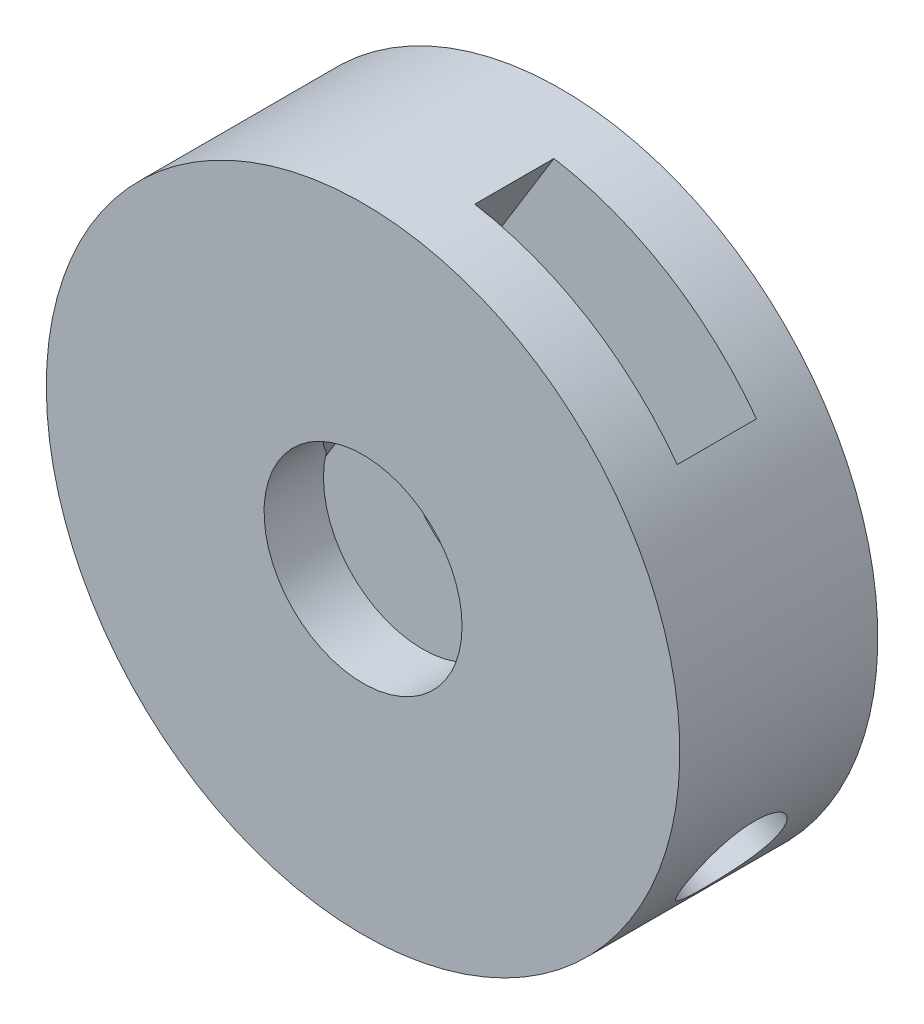
ISO-10303-21;
HEADER;
FILE_DESCRIPTION(('STEP AP214'),'2;1');
FILE_NAME('part.step','',(''),(''),'','','');
FILE_SCHEMA(('AUTOMOTIVE_DESIGN { 1 0 10303 214 1 1 1 1 }'));
ENDSEC;
DATA;
#1=APPLICATION_CONTEXT('core data for automotive mechanical design processes');
#2=APPLICATION_PROTOCOL_DEFINITION('international standard','automotive_design',2000,#1);
#3=PRODUCT_CONTEXT('',#1,'mechanical');
#4=PRODUCT('Part','Part','',(#3));
#5=PRODUCT_RELATED_PRODUCT_CATEGORY('part','',(#4));
#6=PRODUCT_DEFINITION_FORMATION('','',#4);
#7=PRODUCT_DEFINITION_CONTEXT('part definition',#1,'design');
#8=PRODUCT_DEFINITION('design','',#6,#7);
#9=PRODUCT_DEFINITION_SHAPE('','',#8);
#10=(LENGTH_UNIT() NAMED_UNIT(*) SI_UNIT(.MILLI.,.METRE.));
#11=(NAMED_UNIT(*) PLANE_ANGLE_UNIT() SI_UNIT($,.RADIAN.));
#12=(NAMED_UNIT(*) SI_UNIT($,.STERADIAN.) SOLID_ANGLE_UNIT());
#13=UNCERTAINTY_MEASURE_WITH_UNIT(LENGTH_MEASURE(1.E-05),#10,'distance_accuracy_value','');
#14=(GEOMETRIC_REPRESENTATION_CONTEXT(3) GLOBAL_UNCERTAINTY_ASSIGNED_CONTEXT((#13)) GLOBAL_UNIT_ASSIGNED_CONTEXT((#10,
#11,#12)) REPRESENTATION_CONTEXT('',''));
#15=CARTESIAN_POINT('',(0.,0.,0.));
#16=DIRECTION('',(0.,0.,1.));
#17=DIRECTION('',(1.,0.,0.));
#18=AXIS2_PLACEMENT_3D('',#15,#16,#17);
#19=CARTESIAN_POINT('',(60.,0.,21.));
#20=DIRECTION('',(0.,0.,1.));
#21=DIRECTION('',(0.522918964785246,0.852382400257024,0.));
#22=AXIS2_PLACEMENT_3D('',#19,#20,#21);
#23=CYLINDRICAL_SURFACE('',#22,8.);
#24=DIRECTION('',(0.,0.,1.));
#25=VECTOR('',#24,1.);
#26=CARTESIAN_POINT('',(61.3209236347429,7.89019396156885,21.));
#27=LINE('',#26,#25);
#28=CARTESIAN_POINT('',(61.3209236347429,7.89019396156885,22.5));
#29=VERTEX_POINT('',#28);
#30=CARTESIAN_POINT('',(61.3209236347429,7.89019396156885,24.5));
#31=VERTEX_POINT('',#30);
#32=EDGE_CURVE('E163',#29,#31,#27,.T.);
#33=ORIENTED_EDGE('',*,*,#32,.F.);
#34=CARTESIAN_POINT('',(60.,0.,22.5));
#35=DIRECTION('',(0.,0.,1.));
#36=DIRECTION('',(-0.852382400257024,0.522918964785246,0.));
#37=AXIS2_PLACEMENT_3D('',#34,#35,#36);
#38=CIRCLE('',#37,8.);
#39=CARTESIAN_POINT('',(66.4352180362851,4.75268017285738,22.5));
#40=VERTEX_POINT('',#39);
#41=EDGE_CURVE('E158',#40,#29,#38,.T.);
#42=ORIENTED_EDGE('',*,*,#41,.F.);
#43=DIRECTION('',(0.,0.,1.));
#44=VECTOR('',#43,1.);
#45=CARTESIAN_POINT('',(66.4352180362851,4.75268017285738,21.));
#46=LINE('',#45,#44);
#47=CARTESIAN_POINT('',(66.4352180362851,4.75268017285738,24.5));
#48=VERTEX_POINT('',#47);
#49=EDGE_CURVE('E160',#48,#40,#46,.F.);
#50=ORIENTED_EDGE('',*,*,#49,.F.);
#51=CARTESIAN_POINT('',(60.,0.,24.5));
#52=DIRECTION('',(0.,0.,-1.));
#53=DIRECTION('',(0.852382400257024,-0.522918964785246,0.));
#54=AXIS2_PLACEMENT_3D('',#51,#52,#53);
#55=CIRCLE('',#54,8.);
#56=EDGE_CURVE('E145',#31,#48,#55,.T.);
#57=ORIENTED_EDGE('',*,*,#56,.F.);
#58=EDGE_LOOP('',(#33,#42,#50,#57));
#59=FACE_BOUND('',#58,.T.);
#60=CARTESIAN_POINT('',(60.,0.,21.));
#61=DIRECTION('',(0.,0.,-1.));
#62=DIRECTION('',(-0.522918964785246,-0.852382400257024,0.));
#63=AXIS2_PLACEMENT_3D('',#60,#61,#62);
#64=CIRCLE('',#63,8.);
#65=CARTESIAN_POINT('',(55.816648281718,-6.8190592020562,21.));
#66=VERTEX_POINT('',#65);
#67=EDGE_CURVE('E164',#66,#66,#64,.T.);
#68=ORIENTED_EDGE('',*,*,#67,.F.);
#69=EDGE_LOOP('',(#68));
#70=FACE_BOUND('',#69,.T.);
#71=CARTESIAN_POINT('',(60.,0.,26.));
#72=DIRECTION('',(0.,0.,-1.));
#73=DIRECTION('',(-0.522918964785246,-0.852382400257024,0.));
#74=AXIS2_PLACEMENT_3D('',#71,#72,#73);
#75=CIRCLE('',#74,8.);
#76=CARTESIAN_POINT('',(55.816648281718,-6.8190592020562,26.));
#77=VERTEX_POINT('',#76);
#78=EDGE_CURVE('E153',#77,#77,#75,.T.);
#79=ORIENTED_EDGE('',*,*,#78,.T.);
#80=EDGE_LOOP('',(#79));
#81=FACE_BOUND('',#80,.T.);
#82=DIRECTION('',(0.,0.,1.));
#83=VECTOR('',#82,1.);
#84=CARTESIAN_POINT('',(53.564781963715,-4.75268017285738,21.));
#85=LINE('',#84,#83);
#86=CARTESIAN_POINT('',(53.564781963715,-4.75268017285738,24.5));
#87=VERTEX_POINT('',#86);
#88=CARTESIAN_POINT('',(53.564781963715,-4.75268017285738,22.5));
#89=VERTEX_POINT('',#88);
#90=EDGE_CURVE('E133',#87,#89,#85,.F.);
#91=ORIENTED_EDGE('',*,*,#90,.F.);
#92=CARTESIAN_POINT('',(58.6790763652571,-7.89019396156885,24.5));
#93=VERTEX_POINT('',#92);
#94=EDGE_CURVE('E148',#93,#87,#55,.T.);
#95=ORIENTED_EDGE('',*,*,#94,.F.);
#96=DIRECTION('',(0.,0.,1.));
#97=VECTOR('',#96,1.);
#98=CARTESIAN_POINT('',(58.6790763652571,-7.89019396156885,21.));
#99=LINE('',#98,#97);
#100=CARTESIAN_POINT('',(58.6790763652571,-7.89019396156885,22.5));
#101=VERTEX_POINT('',#100);
#102=EDGE_CURVE('E167',#101,#93,#99,.T.);
#103=ORIENTED_EDGE('',*,*,#102,.F.);
#104=EDGE_CURVE('E185',#89,#101,#38,.T.);
#105=ORIENTED_EDGE('',*,*,#104,.F.);
#106=EDGE_LOOP('',(#91,#95,#103,#105));
#107=FACE_BOUND('',#106,.T.);
#108=CARTESIAN_POINT('',(66.0816556696186,-5.19744786565444,23.5));
#109=CARTESIAN_POINT('',(66.0816581873611,-5.19744606185292,23.4302483108364));
#110=CARTESIAN_POINT('',(66.0855147606195,-5.19294270527883,23.3604570011778));
#111=CARTESIAN_POINT('',(66.1007678591854,-5.1750135035863,23.2228281855174));
#112=CARTESIAN_POINT('',(66.1121715932304,-5.16157912787064,23.1549926122641));
#113=CARTESIAN_POINT('',(66.1419723784372,-5.12608122456383,23.0232872051712));
#114=CARTESIAN_POINT('',(66.160363889274,-5.10402453285864,22.9594142760628));
#115=CARTESIAN_POINT('',(66.2033083863163,-5.0517426889622,22.8373515545807));
#116=CARTESIAN_POINT('',(66.2278605806776,-5.02151858650513,22.7791610331707));
#117=CARTESIAN_POINT('',(66.2822907498275,-4.95325528150399,22.6696017574239));
#118=CARTESIAN_POINT('',(66.3122085861719,-4.91515723601717,22.6182894628001));
#119=CARTESIAN_POINT('',(66.3760153786332,-4.83209738369315,22.5244328897852));
#120=CARTESIAN_POINT('',(66.4099045589944,-4.78713518922426,22.4818891068879));
#121=CARTESIAN_POINT('',(66.4805245661256,-4.69109444552918,22.4065675614794));
#122=CARTESIAN_POINT('',(66.5172693177667,-4.63998516025116,22.3738419980128));
#123=CARTESIAN_POINT('',(66.5920778504843,-4.5330741344393,22.3194210226375));
#124=CARTESIAN_POINT('',(66.6301415559198,-4.47727266273786,22.2977249793087));
#125=CARTESIAN_POINT('',(66.7059491955377,-4.36290175962816,22.2661506405219));
#126=CARTESIAN_POINT('',(66.7436932129058,-4.30435852816301,22.2561776754658));
#127=CARTESIAN_POINT('',(66.8179723986721,-4.18570777546265,22.2480384783483));
#128=CARTESIAN_POINT('',(66.854507639577,-4.12560034844128,22.2498715368241));
#129=CARTESIAN_POINT('',(66.9250242913601,-4.00609689695609,22.2652179631389));
#130=CARTESIAN_POINT('',(66.9590251722564,-3.94669923579935,22.2786294694202));
#131=CARTESIAN_POINT('',(67.024011653137,-3.82984762900055,22.3165920143113));
#132=CARTESIAN_POINT('',(67.0549971701946,-3.77239373684314,22.3411433591771));
#133=CARTESIAN_POINT('',(67.1134705577881,-3.66094483622809,22.40079182793));
#134=CARTESIAN_POINT('',(67.1409436664854,-3.6069648709101,22.435931502714));
#135=CARTESIAN_POINT('',(67.1918352787967,-3.50439559724323,22.5157280403146));
#136=CARTESIAN_POINT('',(67.2152534929861,-3.4558066737776,22.5603855819775));
#137=CARTESIAN_POINT('',(67.2580118054213,-3.36508710905455,22.6585167435366));
#138=CARTESIAN_POINT('',(67.2773057319372,-3.32303089652116,22.7120793331974));
#139=CARTESIAN_POINT('',(67.3113564595167,-3.24742840761879,22.8261987823411));
#140=CARTESIAN_POINT('',(67.3261132279398,-3.2138821924714,22.886755692137));
#141=CARTESIAN_POINT('',(67.3510368792228,-3.15646039968872,23.0132398140529));
#142=CARTESIAN_POINT('',(67.361199639287,-3.13259351052714,23.0791717875367));
#143=CARTESIAN_POINT('',(67.3768903887359,-3.09546415901837,23.2144824243527));
#144=CARTESIAN_POINT('',(67.3824187340852,-3.08220088222206,23.2838608225349));
#145=CARTESIAN_POINT('',(67.3888010312846,-3.06686950517274,23.4233140516376));
#146=CARTESIAN_POINT('',(67.3897034990963,-3.06468521167648,23.4933739000974));
#147=CARTESIAN_POINT('',(67.3869643218478,-3.07128155172007,23.632883817649));
#148=CARTESIAN_POINT('',(67.3833228302398,-3.08006181497998,23.7023339072529));
#149=CARTESIAN_POINT('',(67.3715322944845,-3.10817301334998,23.8382639037332));
#150=CARTESIAN_POINT('',(67.3634080563929,-3.12744587807843,23.9047579993198));
#151=CARTESIAN_POINT('',(67.342683659506,-3.17579665646372,24.0333369855519));
#152=CARTESIAN_POINT('',(67.3300832624981,-3.20487509195014,24.0954216413245));
#153=CARTESIAN_POINT('',(67.3003268858777,-3.27209170562955,24.2139756408244));
#154=CARTESIAN_POINT('',(67.2831346273671,-3.31030176528305,24.27039511445));
#155=CARTESIAN_POINT('',(67.2443410062551,-3.39435719073198,24.3755034904241));
#156=CARTESIAN_POINT('',(67.2227393723734,-3.44020302627532,24.4241919168035));
#157=CARTESIAN_POINT('',(67.1751054571169,-3.53848341204845,24.5129056353177));
#158=CARTESIAN_POINT('',(67.1490347417554,-3.59097398615296,24.552848288215));
#159=CARTESIAN_POINT('',(67.0929493323505,-3.70052034867109,24.6223597599951));
#160=CARTESIAN_POINT('',(67.0629347535935,-3.75757600361977,24.651928882023));
#161=CARTESIAN_POINT('',(66.9996278036831,-3.8742215842315,24.6997231376421));
#162=CARTESIAN_POINT('',(66.9663488892711,-3.93380057435593,24.7179927487197));
#163=CARTESIAN_POINT('',(66.8971692183033,-4.0538690283334,24.7428130663364));
#164=CARTESIAN_POINT('',(66.8612686504988,-4.11435842639122,24.749364615678));
#165=CARTESIAN_POINT('',(66.788207892442,-4.23380248743842,24.7505409263276));
#166=CARTESIAN_POINT('',(66.7510651732151,-4.2927666325606,24.7452918723214));
#167=CARTESIAN_POINT('',(66.6762804689185,-4.4081752134045,24.7232873419098));
#168=CARTESIAN_POINT('',(66.6386384858586,-4.46461965926554,24.7065319118108));
#169=CARTESIAN_POINT('',(66.5641273325081,-4.57346502399968,24.6620363701438));
#170=CARTESIAN_POINT('',(66.5272575250261,-4.62586938085843,24.6343057242094));
#171=CARTESIAN_POINT('',(66.4555503770553,-4.72542459269482,24.5686605807392));
#172=CARTESIAN_POINT('',(66.4207131138022,-4.77257524809616,24.5307456965136));
#173=CARTESIAN_POINT('',(66.3540265751209,-4.86101319496993,24.4453552783951));
#174=CARTESIAN_POINT('',(66.3222111189505,-4.90223629632503,24.3977868428455));
#175=CARTESIAN_POINT('',(66.2632358977114,-4.97736508196464,24.2946350213348));
#176=CARTESIAN_POINT('',(66.2360772257642,-5.01126904865684,24.239049759147));
#177=CARTESIAN_POINT('',(66.1874226763427,-5.07122321743194,24.1210394478543));
#178=CARTESIAN_POINT('',(66.165962570228,-5.09722394967273,24.0585745206629));
#179=CARTESIAN_POINT('',(66.1299162133721,-5.14051823129271,23.9288783911525));
#180=CARTESIAN_POINT('',(66.1153229261627,-5.15782069508573,23.8616521494331));
#181=CARTESIAN_POINT('',(66.0969424533288,-5.17951962582171,23.7451151301565));
#182=CARTESIAN_POINT('',(66.0912233179715,-5.18623500057402,23.6965192000094));
#183=CARTESIAN_POINT('',(66.0835790639197,-5.19519972532623,23.598622109475));
#184=CARTESIAN_POINT('',(66.0816538893395,-5.1974491411106,23.5493209594866));
#185=CARTESIAN_POINT('',(66.0816556696186,-5.19744786565444,23.5));
#186=B_SPLINE_CURVE_WITH_KNOTS('',3,(#108,#109,#110,#111,#112,#113,#114,#115,#116,#117,#118,
#119,#120,#121,#122,#123,#124,#125,#126,#127,#128,#129,#130,#131,#132,#133,#134,#135,#136,#137,
#138,#139,#140,#141,#142,#143,#144,#145,#146,#147,#148,#149,#150,#151,#152,#153,#154,#155,#156,
#157,#158,#159,#160,#161,#162,#163,#164,#165,#166,#167,#168,#169,#170,#171,#172,#173,#174,#175,
#176,#177,#178,#179,#180,#181,#182,#183,#184,#185),.UNSPECIFIED.,.T.,.F.,(4,2,2,2,2,2,2,2,2,2,2,
2,2,2,2,2,2,2,2,2,2,2,2,2,2,2,2,2,2,2,2,2,2,2,2,2,2,2,4),(0.,0.209074763941297,
0.418349516267962,0.627458688206191,0.836540996707041,1.04724629023635,1.25796348710333,
1.46978189009239,1.68158816549379,1.89167198756851,2.10174318513256,2.30998489573485,
2.5182323316538,2.72732806463509,2.93643871601874,3.14778021695736,3.3591232382602,
3.57065555017417,3.78217161301618,3.99146470015322,4.20075071952324,4.40889006724113,
4.61704049339772,4.82688676416583,5.03674594931015,5.24850985997734,5.46026758176487,
5.67118638114213,5.88209000991818,6.09074917034593,6.29940749105005,6.50788624405681,
6.71637291400442,6.92697020198999,7.1376168575629,7.34955610829279,7.56127770816943,
7.70911527287133,7.85695065988004),.UNSPECIFIED.);
#187=CARTESIAN_POINT('',(66.0816556696186,-5.19744786565444,23.5));
#188=VERTEX_POINT('',#187);
#189=EDGE_CURVE('E267',#188,#188,#186,.T.);
#190=ORIENTED_EDGE('',*,*,#189,.F.);
#191=EDGE_LOOP('',(#190));
#192=FACE_BOUND('',#191,.T.);
#193=CARTESIAN_POINT('',(52.6110469184183,3.06649186501188,23.5));
#194=CARTESIAN_POINT('',(52.611047385606,3.06649492678637,23.5697516891636));
#195=CARTESIAN_POINT('',(52.6133144623956,3.0719734065536,23.6395429988222));
#196=CARTESIAN_POINT('',(52.6223861636146,3.09369476761102,23.7771718144826));
#197=CARTESIAN_POINT('',(52.6291951263156,3.10994794046975,23.8450073877359));
#198=CARTESIAN_POINT('',(52.6473367898369,3.1525984736763,23.9767127948288));
#199=CARTESIAN_POINT('',(52.6586659071655,3.1789877976614,24.0405857239372));
#200=CARTESIAN_POINT('',(52.6858141119044,3.24096034002397,24.1626484454193));
#201=CARTESIAN_POINT('',(52.7016326223188,3.27654237686228,24.2208389668293));
#202=CARTESIAN_POINT('',(52.7378232717421,3.35599524979763,24.3303982425761));
#203=CARTESIAN_POINT('',(52.7582298047886,3.39992828304675,24.3817105372));
#204=CARTESIAN_POINT('',(52.8033622372398,3.49444446882109,24.4755671102148));
#205=CARTESIAN_POINT('',(52.8280883805926,3.54502799689014,24.5181108931121));
#206=CARTESIAN_POINT('',(52.8817055325596,3.65149964039982,24.5934324385206));
#207=CARTESIAN_POINT('',(52.9106176314261,3.70741409607931,24.6261580019872));
#208=CARTESIAN_POINT('',(52.9720272690152,3.82254506679822,24.6805789773625));
#209=CARTESIAN_POINT('',(53.0045246023601,3.88176139259611,24.7022750206913));
#210=CARTESIAN_POINT('',(53.0721316694085,4.00116317728824,24.7338493594781));
#211=CARTESIAN_POINT('',(53.1072180093797,4.06133683884289,24.7438223245342));
#212=CARTESIAN_POINT('',(53.179332924837,4.18131532659406,24.7519615216517));
#213=CARTESIAN_POINT('',(53.2163613834821,4.24112017473761,24.7501284631759));
#214=CARTESIAN_POINT('',(53.2909412880136,4.35813090473983,24.7347820368611));
#215=CARTESIAN_POINT('',(53.3284853708467,4.4153548848254,24.7213705305798));
#216=CARTESIAN_POINT('',(53.4032070623392,4.52623414135792,24.6834079856887));
#217=CARTESIAN_POINT('',(53.4403846608945,4.57988931964506,24.6588566408229));
#218=CARTESIAN_POINT('',(53.5132412467383,4.68251442575532,24.59920817207));
#219=CARTESIAN_POINT('',(53.5489135125212,4.73146437786088,24.564068497286));
#220=CARTESIAN_POINT('',(53.6172897104486,4.82330722004905,24.4842719596854));
#221=CARTESIAN_POINT('',(53.649993430629,4.86619967772785,24.4396144180225));
#222=CARTESIAN_POINT('',(53.7114914517687,4.94542281892882,24.3414832564634));
#223=CARTESIAN_POINT('',(53.7402403238982,4.98167861797304,24.2879206668026));
#224=CARTESIAN_POINT('',(53.7922076766217,5.04628962808619,24.1738012176589));
#225=CARTESIAN_POINT('',(53.8154261174292,5.0746447823174,24.113244307863));
#226=CARTESIAN_POINT('',(53.8553218020433,5.12288154245757,23.9867601859471));
#227=CARTESIAN_POINT('',(53.8719931685629,5.14275553623702,23.9208282124633));
#228=CARTESIAN_POINT('',(53.8979826125005,5.17356685178084,23.7855175756473));
#229=CARTESIAN_POINT('',(53.9073012546707,5.18450485990761,23.7161391774651));
#230=CARTESIAN_POINT('',(53.9180765773482,5.19714120672799,23.5766859483624));
#231=CARTESIAN_POINT('',(53.9196148556282,5.19893544365839,23.5066260999026));
#232=CARTESIAN_POINT('',(53.9149756756817,5.19350471595455,23.3671161823511));
#233=CARTESIAN_POINT('',(53.9087984780116,5.18628005589408,23.2976660927471));
#234=CARTESIAN_POINT('',(53.8890810696356,5.16303182985144,23.1617360962668));
#235=CARTESIAN_POINT('',(53.8755813860852,5.14705668968154,23.0952420006802));
#236=CARTESIAN_POINT('',(53.8418693616198,5.10667355207146,22.9666630144481));
#237=CARTESIAN_POINT('',(53.8216566634548,5.08226510582872,22.9045783586755));
#238=CARTESIAN_POINT('',(53.7752191115814,5.02528204799473,22.7860243591756));
#239=CARTESIAN_POINT('',(53.7489466172553,4.99264252512289,22.72960488555));
#240=CARTESIAN_POINT('',(53.6915929214108,4.91997332147125,22.6244965095759));
#241=CARTESIAN_POINT('',(53.6605114240542,4.87994318600938,22.5758080831965));
#242=CARTESIAN_POINT('',(53.5944824716893,4.79294777486623,22.4870943646823));
#243=CARTESIAN_POINT('',(53.5595024888643,4.74592285199711,22.447151711785));
#244=CARTESIAN_POINT('',(53.4872599075127,4.6462885801388,22.3776402400049));
#245=CARTESIAN_POINT('',(53.4499973757262,4.59367939439674,22.348071117977));
#246=CARTESIAN_POINT('',(53.3746983322521,4.48439071504205,22.3002768623579));
#247=CARTESIAN_POINT('',(53.3366654716878,4.42772817251188,22.2820072512803));
#248=CARTESIAN_POINT('',(53.260976092113,4.3116532900638,22.2571869336636));
#249=CARTESIAN_POINT('',(53.2233195462303,4.25224114822167,22.250635384322));
#250=CARTESIAN_POINT('',(53.1499453493749,4.13298937539165,22.2494590736724));
#251=CARTESIAN_POINT('',(53.1142113291956,4.07316102255304,22.2547081276786));
#252=CARTESIAN_POINT('',(53.0452157165708,3.95420095375824,22.2767126580902));
#253=CARTESIAN_POINT('',(53.0119541141759,3.89506923499948,22.2934680881892));
#254=CARTESIAN_POINT('',(52.9486853567027,3.77932689302592,22.3379636298562));
#255=CARTESIAN_POINT('',(52.9186754255376,3.72271414399351,22.3656942757906));
#256=CARTESIAN_POINT('',(52.8624178834641,3.61368091862738,22.4313394192608));
#257=CARTESIAN_POINT('',(52.8361704154723,3.56126060157606,22.4692543034864));
#258=CARTESIAN_POINT('',(52.7875485061231,3.46174037840621,22.5546447216049));
#259=CARTESIAN_POINT('',(52.7652159633976,3.4146997058762,22.6022131571545));
#260=CARTESIAN_POINT('',(52.7249644702903,3.32808430046515,22.7053649786652));
#261=CARTESIAN_POINT('',(52.7070465557569,3.28851132031233,22.760950240853));
#262=CARTESIAN_POINT('',(52.6756461179774,3.21797211107257,22.8789605521457));
#263=CARTESIAN_POINT('',(52.6621914863975,3.18706018585652,22.9414254793371));
#264=CARTESIAN_POINT('',(52.6399296518707,3.13530938502139,23.0711216088476));
#265=CARTESIAN_POINT('',(52.6311176904402,3.11446019749213,23.1383478505669));
#266=CARTESIAN_POINT('',(52.6201024990569,3.08824281899099,23.2548848698436));
#267=CARTESIAN_POINT('',(52.6167074584876,3.08010166017714,23.3034807999906));
#268=CARTESIAN_POINT('',(52.6121795196563,3.06922514052097,23.401377890525));
#269=CARTESIAN_POINT('',(52.611046588073,3.06648970005133,23.4506790405134));
#270=CARTESIAN_POINT('',(52.6110469184183,3.06649186501188,23.5));
#271=B_SPLINE_CURVE_WITH_KNOTS('',3,(#193,#194,#195,#196,#197,#198,#199,#200,#201,#202,#203,
#204,#205,#206,#207,#208,#209,#210,#211,#212,#213,#214,#215,#216,#217,#218,#219,#220,#221,#222,
#223,#224,#225,#226,#227,#228,#229,#230,#231,#232,#233,#234,#235,#236,#237,#238,#239,#240,#241,
#242,#243,#244,#245,#246,#247,#248,#249,#250,#251,#252,#253,#254,#255,#256,#257,#258,#259,#260,
#261,#262,#263,#264,#265,#266,#267,#268,#269,#270),.UNSPECIFIED.,.T.,.F.,(4,2,2,2,2,2,2,2,2,2,2,
2,2,2,2,2,2,2,2,2,2,2,2,2,2,2,2,2,2,2,2,2,2,2,2,2,2,2,4),(0.,0.209074763941297,
0.418349516267959,0.627458688206181,0.836540996707034,1.04724629023635,1.25796348710333,
1.4697818900924,1.68158816549379,1.89167198756851,2.10174318513255,2.30998489573485,
2.5182323316538,2.72732806463509,2.93643871601874,3.14778021695736,3.3591232382602,
3.57065555017417,3.78217161301618,3.99146470015321,4.20075071952324,4.40889006724113,
4.61704049339771,4.82688676416582,5.03674594931015,5.24850985997734,5.46026758176487,
5.67118638114212,5.88209000991817,6.09074917034593,6.29940749105005,6.50788624405681,
6.71637291400441,6.92697020198998,7.1376168575629,7.34955610829279,7.56127770816942,
7.70911527287133,7.85695065988004),.UNSPECIFIED.);
#272=CARTESIAN_POINT('',(52.6110469184183,3.06649186501188,23.5));
#273=VERTEX_POINT('',#272);
#274=EDGE_CURVE('E264',#273,#273,#271,.T.);
#275=ORIENTED_EDGE('',*,*,#274,.F.);
#276=EDGE_LOOP('',(#275));
#277=FACE_BOUND('',#276,.T.);
#278=ADVANCED_FACE('F38',(#59,#70,#81,#107,#192,#277),#23,.T.);
#279=CARTESIAN_POINT('',(60.,0.,21.));
#280=DIRECTION('',(0.,0.,1.));
#281=DIRECTION('',(0.522918964785246,0.852382400257024,0.));
#282=AXIS2_PLACEMENT_3D('',#279,#280,#281);
#283=CYLINDRICAL_SURFACE('',#282,2.5);
#284=CARTESIAN_POINT('',(60.,0.,21.));
#285=DIRECTION('',(0.,0.,-1.));
#286=DIRECTION('',(-0.522918964785246,-0.852382400257024,0.));
#287=AXIS2_PLACEMENT_3D('',#284,#285,#286);
#288=CIRCLE('',#287,2.5);
#289=CARTESIAN_POINT('',(58.6927025880369,-2.13095600064256,21.));
#290=VERTEX_POINT('',#289);
#291=EDGE_CURVE('E196',#290,#290,#288,.T.);
#292=ORIENTED_EDGE('',*,*,#291,.T.);
#293=EDGE_LOOP('',(#292));
#294=FACE_BOUND('',#293,.T.);
#295=CARTESIAN_POINT('',(60.,0.,22.5));
#296=DIRECTION('',(0.,0.,1.));
#297=DIRECTION('',(-0.852382400257024,0.522918964785246,0.));
#298=AXIS2_PLACEMENT_3D('',#295,#296,#297);
#299=CIRCLE('',#298,2.5);
#300=CARTESIAN_POINT('',(57.5750083109035,0.607795448989768,22.5));
#301=VERTEX_POINT('',#300);
#302=CARTESIAN_POINT('',(61.6406132419187,-1.8863690493753,22.5));
#303=VERTEX_POINT('',#302);
#304=EDGE_CURVE('E155',#301,#303,#299,.T.);
#305=ORIENTED_EDGE('',*,*,#304,.T.);
#306=CARTESIAN_POINT('',(61.6406132419187,-1.8863690493753,22.5));
#307=CARTESIAN_POINT('',(61.6614713770785,-1.86822894833015,22.480225565105));
#308=CARTESIAN_POINT('',(61.6825639034855,-1.84927527122091,22.4614645635044));
#309=CARTESIAN_POINT('',(61.7250262923621,-1.80973129593458,22.4260756253128));
#310=CARTESIAN_POINT('',(61.7463962789992,-1.78914024229096,22.4094486827092));
#311=CARTESIAN_POINT('',(61.8107176726688,-1.7248109870552,22.362873356406));
#312=CARTESIAN_POINT('',(61.8537690075148,-1.6786118010024,22.336335422231));
#313=CARTESIAN_POINT('',(61.9383537642321,-1.58019241603644,22.2933621426807));
#314=CARTESIAN_POINT('',(61.9798819713121,-1.5279536895267,22.276958919303));
#315=CARTESIAN_POINT('',(62.0594340621754,-1.41889650299206,22.2551850711776));
#316=CARTESIAN_POINT('',(62.0974667539575,-1.36209027020263,22.2497859474949));
#317=CARTESIAN_POINT('',(62.1664957216136,-1.24916249835665,22.2502136695463));
#318=CARTESIAN_POINT('',(62.1977808944241,-1.19321372339857,22.2553705098563));
#319=CARTESIAN_POINT('',(62.2554011883314,-1.08036701654614,22.2753464169745));
#320=CARTESIAN_POINT('',(62.2817251728245,-1.0234672541836,22.2901868958252));
#321=CARTESIAN_POINT('',(62.3316168741067,-0.904515256787063,22.3310225660911));
#322=CARTESIAN_POINT('',(62.3545904892903,-0.842561311086513,22.3580393058439));
#323=CARTESIAN_POINT('',(62.3843565712383,-0.752233863071163,22.4059625817496));
#324=CARTESIAN_POINT('',(62.3934913800465,-0.722578777459187,22.4231551954952));
#325=CARTESIAN_POINT('',(62.4103048422682,-0.664339337499371,22.4598655341991));
#326=CARTESIAN_POINT('',(62.4179844005495,-0.63575432671697,22.4793818019451));
#327=CARTESIAN_POINT('',(62.4249916890966,-0.607795448989766,22.5));
#328=B_SPLINE_CURVE_WITH_KNOTS('',3,(#306,#307,#308,#309,#310,#311,#312,#313,#314,#315,#316,
#317,#318,#319,#320,#321,#322,#323,#324,#325,#326,#327),.UNSPECIFIED.,.F.,.F.,(4,2,2,2,2,2,2,2,
2,2,4),(0.,0.101911034013877,0.203869364503758,0.408320517726263,0.613416399211569,
0.817980435296743,1.0099632187663,1.20237195136825,1.41531786785734,1.52163981741202,
1.62789543798857),.UNSPECIFIED.);
#329=CARTESIAN_POINT('',(62.4249916890966,-0.607795448989766,22.5));
#330=VERTEX_POINT('',#329);
#331=EDGE_CURVE('E277',#303,#330,#328,.T.);
#332=ORIENTED_EDGE('',*,*,#331,.T.);
#333=CARTESIAN_POINT('',(58.3593867580813,1.8863690493753,22.5));
#334=VERTEX_POINT('',#333);
#335=EDGE_CURVE('E159',#330,#334,#299,.T.);
#336=ORIENTED_EDGE('',*,*,#335,.T.);
#337=CARTESIAN_POINT('',(58.3593867580813,1.8863690493753,22.5));
#338=CARTESIAN_POINT('',(58.3385286229215,1.86822894833015,22.480225565105));
#339=CARTESIAN_POINT('',(58.3174360965145,1.84927527122091,22.4614645635044));
#340=CARTESIAN_POINT('',(58.2749737076379,1.80973129593458,22.4260756253128));
#341=CARTESIAN_POINT('',(58.2536037210008,1.78914024229096,22.4094486827092));
#342=CARTESIAN_POINT('',(58.1892823273312,1.7248109870552,22.362873356406));
#343=CARTESIAN_POINT('',(58.1462309924852,1.6786118010024,22.336335422231));
#344=CARTESIAN_POINT('',(58.0616462357679,1.58019241603644,22.2933621426807));
#345=CARTESIAN_POINT('',(58.0201180286879,1.5279536895267,22.276958919303));
#346=CARTESIAN_POINT('',(57.9405659378246,1.41889650299205,22.2551850711776));
#347=CARTESIAN_POINT('',(57.9025332460425,1.36209027020263,22.2497859474949));
#348=CARTESIAN_POINT('',(57.8335042783864,1.24916249835665,22.2502136695463));
#349=CARTESIAN_POINT('',(57.8022191055759,1.19321372339857,22.2553705098563));
#350=CARTESIAN_POINT('',(57.7445988116686,1.08036701654614,22.2753464169745));
#351=CARTESIAN_POINT('',(57.7182748271756,1.0234672541836,22.2901868958252));
#352=CARTESIAN_POINT('',(57.6683831258933,0.904515256787063,22.3310225660911));
#353=CARTESIAN_POINT('',(57.6454095107098,0.842561311086513,22.3580393058439));
#354=CARTESIAN_POINT('',(57.6156434287617,0.752233863071163,22.4059625817496));
#355=CARTESIAN_POINT('',(57.6065086199535,0.722578777459187,22.4231551954952));
#356=CARTESIAN_POINT('',(57.5896951577318,0.664339337499371,22.4598655341991));
#357=CARTESIAN_POINT('',(57.5820155994505,0.63575432671697,22.4793818019451));
#358=CARTESIAN_POINT('',(57.5750083109035,0.607795448989766,22.5));
#359=B_SPLINE_CURVE_WITH_KNOTS('',3,(#337,#338,#339,#340,#341,#342,#343,#344,#345,#346,#347,
#348,#349,#350,#351,#352,#353,#354,#355,#356,#357,#358),.UNSPECIFIED.,.F.,.F.,(4,2,2,2,2,2,2,2,
2,2,4),(0.,0.101911034013876,0.203869364503758,0.408320517726263,0.613416399211571,
0.817980435296743,1.0099632187663,1.20237195136825,1.41531786785734,1.52163981741202,
1.62789543798857),.UNSPECIFIED.);
#360=EDGE_CURVE('E281',#334,#301,#359,.T.);
#361=ORIENTED_EDGE('',*,*,#360,.T.);
#362=EDGE_LOOP('',(#305,#332,#336,#361));
#363=FACE_BOUND('',#362,.T.);
#364=ADVANCED_FACE('F216',(#294,#363),#283,.F.);
#365=CARTESIAN_POINT('',(60.,0.,26.));
#366=DIRECTION('',(0.,0.,-1.));
#367=DIRECTION('',(-0.522918964785246,-0.852382400257024,0.));
#368=AXIS2_PLACEMENT_3D('',#365,#366,#367);
#369=CIRCLE('',#368,2.5);
#370=CARTESIAN_POINT('',(58.6927025880369,-2.13095600064256,26.));
#371=VERTEX_POINT('',#370);
#372=EDGE_CURVE('E193',#371,#371,#369,.T.);
#373=ORIENTED_EDGE('',*,*,#372,.F.);
#374=EDGE_LOOP('',(#373));
#375=FACE_BOUND('',#374,.T.);
#376=CARTESIAN_POINT('',(60.,0.,24.5));
#377=DIRECTION('',(0.,0.,-1.));
#378=DIRECTION('',(0.852382400257024,-0.522918964785246,0.));
#379=AXIS2_PLACEMENT_3D('',#376,#377,#378);
#380=CIRCLE('',#379,2.5);
#381=CARTESIAN_POINT('',(61.6406132419187,-1.88636904937531,24.5));
#382=VERTEX_POINT('',#381);
#383=CARTESIAN_POINT('',(57.5750083109035,0.607795448989763,24.5));
#384=VERTEX_POINT('',#383);
#385=EDGE_CURVE('E138',#382,#384,#380,.T.);
#386=ORIENTED_EDGE('',*,*,#385,.T.);
#387=CARTESIAN_POINT('',(57.5750083109035,0.607795448989766,24.5));
#388=CARTESIAN_POINT('',(57.5817283125522,0.634609002393115,24.519774434895));
#389=CARTESIAN_POINT('',(57.5890673743387,0.662000145455879,24.5385354364957));
#390=CARTESIAN_POINT('',(57.6050788058922,0.7177712357282,24.5739243746872));
#391=CARTESIAN_POINT('',(57.613751792861,0.746151635937904,24.5905513172908));
#392=CARTESIAN_POINT('',(57.6419535907927,0.832639515760471,24.637126643594));
#393=CARTESIAN_POINT('',(57.6636309773721,0.891951176798179,24.6636645777691));
#394=CARTESIAN_POINT('',(57.7130409894381,1.01194953976054,24.7066378573193));
#395=CARTESIAN_POINT('',(57.7407924943038,1.07263998800676,24.723041080697));
#396=CARTESIAN_POINT('',(57.8019659743145,1.19297207200333,24.7448149288224));
#397=CARTESIAN_POINT('',(57.8353730584376,1.25261601937695,24.7502140525051));
#398=CARTESIAN_POINT('',(57.9047651348782,1.36532103149724,24.7497863304537));
#399=CARTESIAN_POINT('',(57.940465213448,1.41856135312663,24.7446294901437));
#400=CARTESIAN_POINT('',(58.0149544256068,1.52105932768886,24.7246535830255));
#401=CARTESIAN_POINT('',(58.053750237097,1.57030788225972,24.7098131041748));
#402=CARTESIAN_POINT('',(58.1371839482784,1.66868255064528,24.6689774339089));
#403=CARTESIAN_POINT('',(58.1820034218425,1.71723451427096,24.6419606941561));
#404=CARTESIAN_POINT('',(58.2490388182428,1.78469800905856,24.5940374182504));
#405=CARTESIAN_POINT('',(58.2713358712903,1.8062783301871,24.5768448045049));
#406=CARTESIAN_POINT('',(58.3156352706567,1.84765571645658,24.5401344658009));
#407=CARTESIAN_POINT('',(58.3376377921506,1.86745388568343,24.5206181980549));
#408=CARTESIAN_POINT('',(58.3593867580813,1.8863690493753,24.5));
#409=B_SPLINE_CURVE_WITH_KNOTS('',3,(#387,#388,#389,#390,#391,#392,#393,#394,#395,#396,#397,
#398,#399,#400,#401,#402,#403,#404,#405,#406,#407,#408),.UNSPECIFIED.,.F.,.F.,(4,2,2,2,2,2,2,2,
2,2,4),(0.,0.101911034013878,0.203869364503764,0.408320517726261,0.613416399211565,
0.817980435296742,1.0099632187663,1.20237195136825,1.41531786785734,1.52163981741202,
1.62789543798856),.UNSPECIFIED.);
#410=CARTESIAN_POINT('',(58.3593867580813,1.8863690493753,24.5));
#411=VERTEX_POINT('',#410);
#412=EDGE_CURVE('E61',#384,#411,#409,.T.);
#413=ORIENTED_EDGE('',*,*,#412,.T.);
#414=CARTESIAN_POINT('',(62.4249916890966,-0.607795448989766,24.5));
#415=VERTEX_POINT('',#414);
#416=EDGE_CURVE('E140',#411,#415,#380,.T.);
#417=ORIENTED_EDGE('',*,*,#416,.T.);
#418=CARTESIAN_POINT('',(62.4249916890966,-0.607795448989766,24.5));
#419=CARTESIAN_POINT('',(62.4182716874478,-0.634609002393115,24.519774434895));
#420=CARTESIAN_POINT('',(62.4109326256613,-0.662000145455879,24.5385354364957));
#421=CARTESIAN_POINT('',(62.3949211941078,-0.7177712357282,24.5739243746872));
#422=CARTESIAN_POINT('',(62.386248207139,-0.746151635937904,24.5905513172908));
#423=CARTESIAN_POINT('',(62.3580464092073,-0.832639515760471,24.637126643594));
#424=CARTESIAN_POINT('',(62.3363690226279,-0.891951176798179,24.6636645777691));
#425=CARTESIAN_POINT('',(62.2869590105619,-1.01194953976054,24.7066378573193));
#426=CARTESIAN_POINT('',(62.2592075056962,-1.07263998800676,24.723041080697));
#427=CARTESIAN_POINT('',(62.1980340256856,-1.19297207200333,24.7448149288224));
#428=CARTESIAN_POINT('',(62.1646269415624,-1.25261601937695,24.7502140525051));
#429=CARTESIAN_POINT('',(62.0952348651218,-1.36532103149724,24.7497863304537));
#430=CARTESIAN_POINT('',(62.059534786552,-1.41856135312663,24.7446294901437));
#431=CARTESIAN_POINT('',(61.9850455743932,-1.52105932768886,24.7246535830255));
#432=CARTESIAN_POINT('',(61.946249762903,-1.57030788225972,24.7098131041748));
#433=CARTESIAN_POINT('',(61.8628160517216,-1.66868255064528,24.6689774339089));
#434=CARTESIAN_POINT('',(61.8179965781575,-1.71723451427096,24.6419606941561));
#435=CARTESIAN_POINT('',(61.7509611817572,-1.78469800905856,24.5940374182504));
#436=CARTESIAN_POINT('',(61.7286641287097,-1.80627833018711,24.5768448045049));
#437=CARTESIAN_POINT('',(61.6843647293434,-1.84765571645658,24.5401344658009));
#438=CARTESIAN_POINT('',(61.6623622078494,-1.86745388568344,24.5206181980549));
#439=CARTESIAN_POINT('',(61.6406132419187,-1.8863690493753,24.5));
#440=B_SPLINE_CURVE_WITH_KNOTS('',3,(#418,#419,#420,#421,#422,#423,#424,#425,#426,#427,#428,
#429,#430,#431,#432,#433,#434,#435,#436,#437,#438,#439),.UNSPECIFIED.,.F.,.F.,(4,2,2,2,2,2,2,2,
2,2,4),(0.,0.101911034013878,0.203869364503764,0.408320517726261,0.613416399211565,
0.817980435296742,1.00996321876629,1.20237195136825,1.41531786785734,1.52163981741202,
1.62789543798856),.UNSPECIFIED.);
#441=EDGE_CURVE('E128',#415,#382,#440,.T.);
#442=ORIENTED_EDGE('',*,*,#441,.T.);
#443=EDGE_LOOP('',(#386,#413,#417,#442));
#444=FACE_BOUND('',#443,.T.);
#445=ADVANCED_FACE('F137',(#375,#444),#283,.F.);
#446=CARTESIAN_POINT('',(52.2136631513765,-6.95506710821451,24.5));
#447=DIRECTION('',(0.852382400257024,-0.522918964785246,0.));
#448=DIRECTION('',(-0.522918964785246,-0.852382400257024,0.));
#449=AXIS2_PLACEMENT_3D('',#446,#447,#448);
#450=PLANE('',#449);
#451=DIRECTION('',(0.522918964785246,0.852382400257024,0.));
#452=VECTOR('',#451,1.);
#453=CARTESIAN_POINT('',(52.2136631513765,-6.95506710821451,24.5));
#454=LINE('',#453,#452);
#455=CARTESIAN_POINT('',(57.8350420228179,2.20804369454851,24.5));
#456=VERTEX_POINT('',#455);
#457=EDGE_CURVE('E240',#456,#31,#454,.T.);
#458=ORIENTED_EDGE('',*,*,#457,.F.);
#459=CARTESIAN_POINT('',(57.4428527992289,1.56875689435574,23.5));
#460=DIRECTION('',(0.852382400257024,-0.522918964785246,0.));
#461=DIRECTION('',(-0.522918964785246,-0.852382400257024,0.));
#462=AXIS2_PLACEMENT_3D('',#459,#460,#461);
#463=CIRCLE('',#462,1.25);
#464=CARTESIAN_POINT('',(57.8350420228179,2.20804369454851,22.5));
#465=VERTEX_POINT('',#464);
#466=EDGE_CURVE('E242',#456,#465,#463,.F.);
#467=ORIENTED_EDGE('',*,*,#466,.T.);
#468=DIRECTION('',(0.522918964785246,0.852382400257024,0.));
#469=VECTOR('',#468,1.);
#470=CARTESIAN_POINT('',(52.2136631513765,-6.95506710821451,22.5));
#471=LINE('',#470,#469);
#472=EDGE_CURVE('E189',#465,#29,#471,.T.);
#473=ORIENTED_EDGE('',*,*,#472,.T.);
#474=ORIENTED_EDGE('',*,*,#32,.T.);
#475=EDGE_LOOP('',(#458,#467,#473,#474));
#476=FACE_BOUND('',#475,.T.);
#477=ADVANCED_FACE('F215',(#476),#450,.T.);
#478=CARTESIAN_POINT('',(57.3279575529186,-10.092580896926,24.5));
#479=DIRECTION('',(-0.852382400257024,0.522918964785246,0.));
#480=DIRECTION('',(0.522918964785246,0.852382400257024,0.));
#481=AXIS2_PLACEMENT_3D('',#478,#479,#480);
#482=PLANE('',#481);
#483=DIRECTION('',(0.522918964785246,0.852382400257024,0.));
#484=VECTOR('',#483,1.);
#485=CARTESIAN_POINT('',(57.3279575529186,-10.092580896926,24.5));
#486=LINE('',#485,#484);
#487=CARTESIAN_POINT('',(62.1649579771821,-2.20804369454851,24.5));
#488=VERTEX_POINT('',#487);
#489=EDGE_CURVE('E254',#93,#488,#486,.T.);
#490=ORIENTED_EDGE('',*,*,#489,.T.);
#491=CARTESIAN_POINT('',(62.5571472007711,-1.56875689435574,23.5));
#492=DIRECTION('',(-0.852382400257024,0.522918964785246,0.));
#493=DIRECTION('',(0.522918964785246,0.852382400257024,0.));
#494=AXIS2_PLACEMENT_3D('',#491,#492,#493);
#495=CIRCLE('',#494,1.25);
#496=CARTESIAN_POINT('',(62.1649579771821,-2.20804369454851,22.5));
#497=VERTEX_POINT('',#496);
#498=EDGE_CURVE('E53',#488,#497,#495,.F.);
#499=ORIENTED_EDGE('',*,*,#498,.T.);
#500=DIRECTION('',(0.522918964785246,0.852382400257024,0.));
#501=VECTOR('',#500,1.);
#502=CARTESIAN_POINT('',(57.3279575529186,-10.092580896926,22.5));
#503=LINE('',#502,#501);
#504=EDGE_CURVE('E245',#101,#497,#503,.T.);
#505=ORIENTED_EDGE('',*,*,#504,.F.);
#506=ORIENTED_EDGE('',*,*,#102,.T.);
#507=EDGE_LOOP('',(#490,#499,#505,#506));
#508=FACE_BOUND('',#507,.T.);
#509=ADVANCED_FACE('F221',(#508),#482,.T.);
#510=CARTESIAN_POINT('',(57.3279575529186,-10.092580896926,22.5));
#511=DIRECTION('',(0.,0.,1.));
#512=DIRECTION('',(-0.852382400257024,0.522918964785246,0.));
#513=AXIS2_PLACEMENT_3D('',#510,#511,#512);
#514=PLANE('',#513);
#515=ORIENTED_EDGE('',*,*,#504,.T.);
#516=DIRECTION('',(0.852382400257024,-0.522918964785246,0.));
#517=VECTOR('',#516,1.);
#518=CARTESIAN_POINT('',(47.6744571728127,6.68157870680068,22.5));
#519=LINE('',#518,#517);
#520=EDGE_CURVE('E141',#497,#303,#519,.F.);
#521=ORIENTED_EDGE('',*,*,#520,.T.);
#522=ORIENTED_EDGE('',*,*,#304,.F.);
#523=CARTESIAN_POINT('',(57.05066357564,0.92947009416297,22.5));
#524=VERTEX_POINT('',#523);
#525=EDGE_CURVE('E188',#301,#524,#519,.F.);
#526=ORIENTED_EDGE('',*,*,#525,.T.);
#527=EDGE_CURVE('E150',#89,#524,#471,.T.);
#528=ORIENTED_EDGE('',*,*,#527,.F.);
#529=ORIENTED_EDGE('',*,*,#104,.T.);
#530=EDGE_LOOP('',(#515,#521,#522,#526,#528,#529));
#531=FACE_BOUND('',#530,.T.);
#532=ADVANCED_FACE('F184',(#531),#514,.T.);
#533=ORIENTED_EDGE('',*,*,#472,.F.);
#534=DIRECTION('',(0.852382400257024,-0.522918964785246,0.));
#535=VECTOR('',#534,1.);
#536=CARTESIAN_POINT('',(48.4588356199906,7.96015230718622,22.5));
#537=LINE('',#536,#535);
#538=EDGE_CURVE('E316',#465,#334,#537,.T.);
#539=ORIENTED_EDGE('',*,*,#538,.T.);
#540=ORIENTED_EDGE('',*,*,#335,.F.);
#541=CARTESIAN_POINT('',(62.94933642436,-0.929470094162969,22.5));
#542=VERTEX_POINT('',#541);
#543=EDGE_CURVE('E251',#330,#542,#537,.T.);
#544=ORIENTED_EDGE('',*,*,#543,.T.);
#545=EDGE_CURVE('E249',#542,#40,#503,.T.);
#546=ORIENTED_EDGE('',*,*,#545,.T.);
#547=ORIENTED_EDGE('',*,*,#41,.T.);
#548=EDGE_LOOP('',(#533,#539,#540,#544,#546,#547));
#549=FACE_BOUND('',#548,.T.);
#550=ADVANCED_FACE('F246',(#549),#514,.T.);
#551=CARTESIAN_POINT('',(57.3279575529186,-10.092580896926,24.5));
#552=DIRECTION('',(0.,0.,-1.));
#553=DIRECTION('',(0.852382400257024,-0.522918964785246,0.));
#554=AXIS2_PLACEMENT_3D('',#551,#552,#553);
#555=PLANE('',#554);
#556=CARTESIAN_POINT('',(62.94933642436,-0.929470094162967,24.5));
#557=VERTEX_POINT('',#556);
#558=EDGE_CURVE('E258',#557,#48,#486,.T.);
#559=ORIENTED_EDGE('',*,*,#558,.F.);
#560=DIRECTION('',(0.852382400257024,-0.522918964785246,0.));
#561=VECTOR('',#560,1.);
#562=CARTESIAN_POINT('',(48.4588356199906,7.96015230718622,24.5));
#563=LINE('',#562,#561);
#564=EDGE_CURVE('E11',#557,#415,#563,.F.);
#565=ORIENTED_EDGE('',*,*,#564,.T.);
#566=ORIENTED_EDGE('',*,*,#416,.F.);
#567=EDGE_CURVE('E42',#411,#456,#563,.F.);
#568=ORIENTED_EDGE('',*,*,#567,.T.);
#569=ORIENTED_EDGE('',*,*,#457,.T.);
#570=ORIENTED_EDGE('',*,*,#56,.T.);
#571=EDGE_LOOP('',(#559,#565,#566,#568,#569,#570));
#572=FACE_BOUND('',#571,.T.);
#573=ADVANCED_FACE('F262',(#572),#555,.T.);
#574=CARTESIAN_POINT('',(57.05066357564,0.929470094162968,24.5));
#575=VERTEX_POINT('',#574);
#576=EDGE_CURVE('E177',#87,#575,#454,.T.);
#577=ORIENTED_EDGE('',*,*,#576,.T.);
#578=DIRECTION('',(0.852382400257024,-0.522918964785246,0.));
#579=VECTOR('',#578,1.);
#580=CARTESIAN_POINT('',(47.6744571728127,6.68157870680068,24.5));
#581=LINE('',#580,#579);
#582=EDGE_CURVE('E132',#575,#384,#581,.T.);
#583=ORIENTED_EDGE('',*,*,#582,.T.);
#584=ORIENTED_EDGE('',*,*,#385,.F.);
#585=EDGE_CURVE('E124',#382,#488,#581,.T.);
#586=ORIENTED_EDGE('',*,*,#585,.T.);
#587=ORIENTED_EDGE('',*,*,#489,.F.);
#588=ORIENTED_EDGE('',*,*,#94,.T.);
#589=EDGE_LOOP('',(#577,#583,#584,#586,#587,#588));
#590=FACE_BOUND('',#589,.T.);
#591=ADVANCED_FACE('F144',(#590),#555,.T.);
#592=CARTESIAN_POINT('',(60.,0.,21.));
#593=DIRECTION('',(0.,0.,-1.));
#594=DIRECTION('',(-0.522918964785246,-0.852382400257024,0.));
#595=AXIS2_PLACEMENT_3D('',#592,#593,#594);
#596=PLANE('',#595);
#597=ORIENTED_EDGE('',*,*,#67,.T.);
#598=EDGE_LOOP('',(#597));
#599=FACE_BOUND('',#598,.T.);
#600=ORIENTED_EDGE('',*,*,#291,.F.);
#601=EDGE_LOOP('',(#600));
#602=FACE_BOUND('',#601,.T.);
#603=ADVANCED_FACE('F211',(#599,#602),#596,.T.);
#604=CARTESIAN_POINT('',(60.,0.,26.));
#605=DIRECTION('',(0.,0.,-1.));
#606=DIRECTION('',(-0.522918964785246,-0.852382400257024,0.));
#607=AXIS2_PLACEMENT_3D('',#604,#605,#606);
#608=PLANE('',#607);
#609=ORIENTED_EDGE('',*,*,#78,.F.);
#610=EDGE_LOOP('',(#609));
#611=FACE_BOUND('',#610,.T.);
#612=ORIENTED_EDGE('',*,*,#372,.T.);
#613=EDGE_LOOP('',(#612));
#614=FACE_BOUND('',#613,.T.);
#615=ADVANCED_FACE('F208',(#611,#614),#608,.F.);
#616=ORIENTED_EDGE('',*,*,#527,.T.);
#617=EDGE_CURVE('E283',#524,#575,#463,.F.);
#618=ORIENTED_EDGE('',*,*,#617,.T.);
#619=ORIENTED_EDGE('',*,*,#576,.F.);
#620=ORIENTED_EDGE('',*,*,#90,.T.);
#621=EDGE_LOOP('',(#616,#618,#619,#620));
#622=FACE_BOUND('',#621,.T.);
#623=ADVANCED_FACE('F175',(#622),#450,.T.);
#624=ORIENTED_EDGE('',*,*,#545,.F.);
#625=EDGE_CURVE('E259',#542,#557,#495,.F.);
#626=ORIENTED_EDGE('',*,*,#625,.T.);
#627=ORIENTED_EDGE('',*,*,#558,.T.);
#628=ORIENTED_EDGE('',*,*,#49,.T.);
#629=EDGE_LOOP('',(#624,#626,#627,#628));
#630=FACE_BOUND('',#629,.T.);
#631=ADVANCED_FACE('F256',(#630),#482,.T.);
#632=CARTESIAN_POINT('',(48.0666463964017,7.32086550699345,23.5));
#633=DIRECTION('',(0.852382400257024,-0.522918964785246,0.));
#634=DIRECTION('',(-0.522918964785246,-0.852382400257024,0.));
#635=AXIS2_PLACEMENT_3D('',#632,#633,#634);
#636=CYLINDRICAL_SURFACE('',#635,1.25);
#637=ORIENTED_EDGE('',*,*,#331,.F.);
#638=ORIENTED_EDGE('',*,*,#520,.F.);
#639=ORIENTED_EDGE('',*,*,#498,.F.);
#640=ORIENTED_EDGE('',*,*,#585,.F.);
#641=ORIENTED_EDGE('',*,*,#441,.F.);
#642=ORIENTED_EDGE('',*,*,#564,.F.);
#643=ORIENTED_EDGE('',*,*,#625,.F.);
#644=ORIENTED_EDGE('',*,*,#543,.F.);
#645=EDGE_LOOP('',(#637,#638,#639,#640,#641,#642,#643,#644));
#646=FACE_BOUND('',#645,.T.);
#647=ORIENTED_EDGE('',*,*,#189,.T.);
#648=EDGE_LOOP('',(#647));
#649=FACE_BOUND('',#648,.T.);
#650=ADVANCED_FACE('F126',(#646,#649),#636,.F.);
#651=ORIENTED_EDGE('',*,*,#466,.F.);
#652=ORIENTED_EDGE('',*,*,#567,.F.);
#653=ORIENTED_EDGE('',*,*,#412,.F.);
#654=ORIENTED_EDGE('',*,*,#582,.F.);
#655=ORIENTED_EDGE('',*,*,#617,.F.);
#656=ORIENTED_EDGE('',*,*,#525,.F.);
#657=ORIENTED_EDGE('',*,*,#360,.F.);
#658=ORIENTED_EDGE('',*,*,#538,.F.);
#659=EDGE_LOOP('',(#651,#652,#653,#654,#655,#656,#657,#658));
#660=FACE_BOUND('',#659,.T.);
#661=ORIENTED_EDGE('',*,*,#274,.T.);
#662=EDGE_LOOP('',(#661));
#663=FACE_BOUND('',#662,.T.);
#664=ADVANCED_FACE('F295',(#660,#663),#636,.F.);
#665=CLOSED_SHELL('',(#278,#364,#445,#477,#509,#532,#550,#573,#591,#603,#615,#623,#631,#650,#664));
#666=MANIFOLD_SOLID_BREP('B2',#665);
#667=ADVANCED_BREP_SHAPE_REPRESENTATION('',(#18,#666),#14);
#668=SHAPE_DEFINITION_REPRESENTATION(#9,#667);
ENDSEC;
END-ISO-10303-21;
